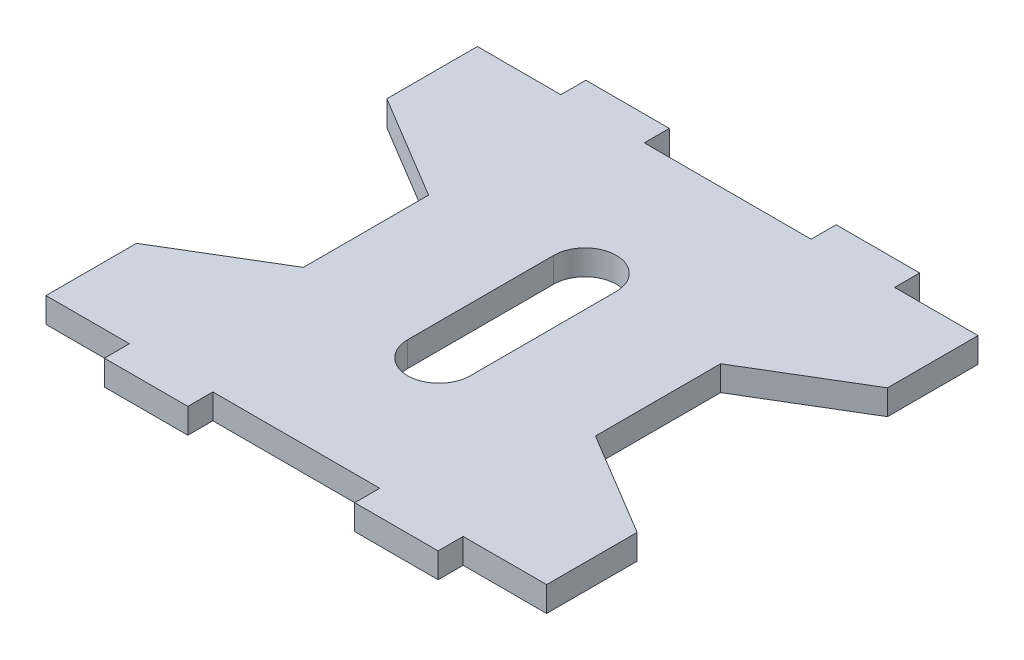
ISO-10303-21;
HEADER;
FILE_DESCRIPTION(('STEP AP214'),'2;1');
FILE_NAME('part.step','',(''),(''),'','','');
FILE_SCHEMA(('AUTOMOTIVE_DESIGN { 1 0 10303 214 1 1 1 1 }'));
ENDSEC;
DATA;
#1=APPLICATION_CONTEXT('core data for automotive mechanical design processes');
#2=APPLICATION_PROTOCOL_DEFINITION('international standard','automotive_design',2000,#1);
#3=PRODUCT_CONTEXT('',#1,'mechanical');
#4=PRODUCT('Part','Part','',(#3));
#5=PRODUCT_RELATED_PRODUCT_CATEGORY('part','',(#4));
#6=PRODUCT_DEFINITION_FORMATION('','',#4);
#7=PRODUCT_DEFINITION_CONTEXT('part definition',#1,'design');
#8=PRODUCT_DEFINITION('design','',#6,#7);
#9=PRODUCT_DEFINITION_SHAPE('','',#8);
#10=(LENGTH_UNIT() NAMED_UNIT(*) SI_UNIT(.MILLI.,.METRE.));
#11=(NAMED_UNIT(*) PLANE_ANGLE_UNIT() SI_UNIT($,.RADIAN.));
#12=(NAMED_UNIT(*) SI_UNIT($,.STERADIAN.) SOLID_ANGLE_UNIT());
#13=UNCERTAINTY_MEASURE_WITH_UNIT(LENGTH_MEASURE(1.E-05),#10,'distance_accuracy_value','');
#14=(GEOMETRIC_REPRESENTATION_CONTEXT(3) GLOBAL_UNCERTAINTY_ASSIGNED_CONTEXT((#13)) GLOBAL_UNIT_ASSIGNED_CONTEXT((#10,
#11,#12)) REPRESENTATION_CONTEXT('',''));
#15=CARTESIAN_POINT('',(0.,0.,0.));
#16=DIRECTION('',(0.,0.,1.));
#17=DIRECTION('',(1.,0.,0.));
#18=AXIS2_PLACEMENT_3D('',#15,#16,#17);
#19=CARTESIAN_POINT('',(0.,3.,0.));
#20=DIRECTION('',(0.,1.,0.));
#21=DIRECTION('',(0.,0.,1.));
#22=AXIS2_PLACEMENT_3D('',#19,#20,#21);
#23=PLANE('',#22);
#24=DIRECTION('',(0.857492925712544,0.,-0.514495755427526));
#25=VECTOR('',#24,1.);
#26=CARTESIAN_POINT('',(17.5,3.,-7.5));
#27=LINE('',#26,#25);
#28=CARTESIAN_POINT('',(17.5,3.,-7.5));
#29=VERTEX_POINT('',#28);
#30=CARTESIAN_POINT('',(30.,3.,-15.));
#31=VERTEX_POINT('',#30);
#32=EDGE_CURVE('E297',#29,#31,#27,.T.);
#33=ORIENTED_EDGE('',*,*,#32,.T.);
#34=DIRECTION('',(0.,0.,-1.));
#35=VECTOR('',#34,1.);
#36=CARTESIAN_POINT('',(30.,3.,-15.));
#37=LINE('',#36,#35);
#38=CARTESIAN_POINT('',(30.,3.,-25.85));
#39=VERTEX_POINT('',#38);
#40=EDGE_CURVE('E301',#31,#39,#37,.T.);
#41=ORIENTED_EDGE('',*,*,#40,.T.);
#42=DIRECTION('',(-1.,0.,0.));
#43=VECTOR('',#42,1.);
#44=CARTESIAN_POINT('',(30.,3.,-25.85));
#45=LINE('',#44,#43);
#46=CARTESIAN_POINT('',(20.,3.,-25.85));
#47=VERTEX_POINT('',#46);
#48=EDGE_CURVE('E305',#39,#47,#45,.T.);
#49=ORIENTED_EDGE('',*,*,#48,.T.);
#50=DIRECTION('',(0.,0.,-1.));
#51=VECTOR('',#50,1.);
#52=CARTESIAN_POINT('',(20.,3.,-25.85));
#53=LINE('',#52,#51);
#54=CARTESIAN_POINT('',(20.,3.,-28.85));
#55=VERTEX_POINT('',#54);
#56=EDGE_CURVE('E308',#47,#55,#53,.T.);
#57=ORIENTED_EDGE('',*,*,#56,.T.);
#58=DIRECTION('',(-1.,0.,0.));
#59=VECTOR('',#58,1.);
#60=CARTESIAN_POINT('',(20.,3.,-28.85));
#61=LINE('',#60,#59);
#62=CARTESIAN_POINT('',(9.99999999999999,3.,-28.85));
#63=VERTEX_POINT('',#62);
#64=EDGE_CURVE('E311',#55,#63,#61,.T.);
#65=ORIENTED_EDGE('',*,*,#64,.T.);
#66=DIRECTION('',(0.,0.,1.));
#67=VECTOR('',#66,1.);
#68=CARTESIAN_POINT('',(9.99999999999999,3.,-28.85));
#69=LINE('',#68,#67);
#70=CARTESIAN_POINT('',(9.99999999999999,3.,-25.85));
#71=VERTEX_POINT('',#70);
#72=EDGE_CURVE('E314',#63,#71,#69,.T.);
#73=ORIENTED_EDGE('',*,*,#72,.T.);
#74=DIRECTION('',(-1.,0.,0.));
#75=VECTOR('',#74,1.);
#76=CARTESIAN_POINT('',(9.99999999999999,3.,-25.85));
#77=LINE('',#76,#75);
#78=CARTESIAN_POINT('',(-9.99999999999999,3.,-25.85));
#79=VERTEX_POINT('',#78);
#80=EDGE_CURVE('E317',#71,#79,#77,.T.);
#81=ORIENTED_EDGE('',*,*,#80,.T.);
#82=DIRECTION('',(0.,0.,-1.));
#83=VECTOR('',#82,1.);
#84=CARTESIAN_POINT('',(-9.99999999999999,3.,-28.85));
#85=LINE('',#84,#83);
#86=CARTESIAN_POINT('',(-9.99999999999999,3.,-28.85));
#87=VERTEX_POINT('',#86);
#88=EDGE_CURVE('E320',#79,#87,#85,.T.);
#89=ORIENTED_EDGE('',*,*,#88,.T.);
#90=DIRECTION('',(-1.,0.,0.));
#91=VECTOR('',#90,1.);
#92=CARTESIAN_POINT('',(-20.,3.,-28.85));
#93=LINE('',#92,#91);
#94=CARTESIAN_POINT('',(-20.,3.,-28.85));
#95=VERTEX_POINT('',#94);
#96=EDGE_CURVE('E323',#87,#95,#93,.T.);
#97=ORIENTED_EDGE('',*,*,#96,.T.);
#98=DIRECTION('',(0.,0.,1.));
#99=VECTOR('',#98,1.);
#100=CARTESIAN_POINT('',(-20.,3.,-25.85));
#101=LINE('',#100,#99);
#102=CARTESIAN_POINT('',(-20.,3.,-25.85));
#103=VERTEX_POINT('',#102);
#104=EDGE_CURVE('E326',#95,#103,#101,.T.);
#105=ORIENTED_EDGE('',*,*,#104,.T.);
#106=DIRECTION('',(-1.,0.,0.));
#107=VECTOR('',#106,1.);
#108=CARTESIAN_POINT('',(-30.,3.,-25.85));
#109=LINE('',#108,#107);
#110=CARTESIAN_POINT('',(-30.,3.,-25.85));
#111=VERTEX_POINT('',#110);
#112=EDGE_CURVE('E329',#103,#111,#109,.T.);
#113=ORIENTED_EDGE('',*,*,#112,.T.);
#114=DIRECTION('',(0.,0.,1.));
#115=VECTOR('',#114,1.);
#116=CARTESIAN_POINT('',(-30.,3.,-15.));
#117=LINE('',#116,#115);
#118=CARTESIAN_POINT('',(-30.,3.,-15.));
#119=VERTEX_POINT('',#118);
#120=EDGE_CURVE('E332',#111,#119,#117,.T.);
#121=ORIENTED_EDGE('',*,*,#120,.T.);
#122=DIRECTION('',(0.857492925712544,0.,0.514495755427526));
#123=VECTOR('',#122,1.);
#124=CARTESIAN_POINT('',(-17.5,3.,-7.5));
#125=LINE('',#124,#123);
#126=CARTESIAN_POINT('',(-17.5,3.,-7.5));
#127=VERTEX_POINT('',#126);
#128=EDGE_CURVE('E335',#119,#127,#125,.T.);
#129=ORIENTED_EDGE('',*,*,#128,.T.);
#130=DIRECTION('',(0.,0.,1.));
#131=VECTOR('',#130,1.);
#132=CARTESIAN_POINT('',(-17.5,3.,7.5));
#133=LINE('',#132,#131);
#134=CARTESIAN_POINT('',(-17.5,3.,7.5));
#135=VERTEX_POINT('',#134);
#136=EDGE_CURVE('E338',#127,#135,#133,.T.);
#137=ORIENTED_EDGE('',*,*,#136,.T.);
#138=DIRECTION('',(-0.857492925712544,0.,0.514495755427526));
#139=VECTOR('',#138,1.);
#140=CARTESIAN_POINT('',(-17.5,3.,7.5));
#141=LINE('',#140,#139);
#142=CARTESIAN_POINT('',(-30.,3.,15.));
#143=VERTEX_POINT('',#142);
#144=EDGE_CURVE('E341',#135,#143,#141,.T.);
#145=ORIENTED_EDGE('',*,*,#144,.T.);
#146=DIRECTION('',(0.,0.,1.));
#147=VECTOR('',#146,1.);
#148=CARTESIAN_POINT('',(-30.,3.,15.));
#149=LINE('',#148,#147);
#150=CARTESIAN_POINT('',(-30.,3.,25.85));
#151=VERTEX_POINT('',#150);
#152=EDGE_CURVE('E344',#143,#151,#149,.T.);
#153=ORIENTED_EDGE('',*,*,#152,.T.);
#154=DIRECTION('',(1.,0.,0.));
#155=VECTOR('',#154,1.);
#156=CARTESIAN_POINT('',(-30.,3.,25.85));
#157=LINE('',#156,#155);
#158=CARTESIAN_POINT('',(-20.,3.,25.85));
#159=VERTEX_POINT('',#158);
#160=EDGE_CURVE('E347',#151,#159,#157,.T.);
#161=ORIENTED_EDGE('',*,*,#160,.T.);
#162=DIRECTION('',(0.,0.,1.));
#163=VECTOR('',#162,1.);
#164=CARTESIAN_POINT('',(-20.,3.,25.85));
#165=LINE('',#164,#163);
#166=CARTESIAN_POINT('',(-20.,3.,28.85));
#167=VERTEX_POINT('',#166);
#168=EDGE_CURVE('E350',#159,#167,#165,.T.);
#169=ORIENTED_EDGE('',*,*,#168,.T.);
#170=DIRECTION('',(1.,0.,0.));
#171=VECTOR('',#170,1.);
#172=CARTESIAN_POINT('',(-20.,3.,28.85));
#173=LINE('',#172,#171);
#174=CARTESIAN_POINT('',(-9.99999999999999,3.,28.85));
#175=VERTEX_POINT('',#174);
#176=EDGE_CURVE('E353',#167,#175,#173,.T.);
#177=ORIENTED_EDGE('',*,*,#176,.T.);
#178=DIRECTION('',(0.,0.,-1.));
#179=VECTOR('',#178,1.);
#180=CARTESIAN_POINT('',(-9.99999999999999,3.,28.85));
#181=LINE('',#180,#179);
#182=CARTESIAN_POINT('',(-9.99999999999999,3.,25.85));
#183=VERTEX_POINT('',#182);
#184=EDGE_CURVE('E356',#175,#183,#181,.T.);
#185=ORIENTED_EDGE('',*,*,#184,.T.);
#186=DIRECTION('',(1.,0.,0.));
#187=VECTOR('',#186,1.);
#188=CARTESIAN_POINT('',(9.99999999999999,3.,25.85));
#189=LINE('',#188,#187);
#190=CARTESIAN_POINT('',(9.99999999999999,3.,25.85));
#191=VERTEX_POINT('',#190);
#192=EDGE_CURVE('E359',#183,#191,#189,.T.);
#193=ORIENTED_EDGE('',*,*,#192,.T.);
#194=DIRECTION('',(0.,0.,1.));
#195=VECTOR('',#194,1.);
#196=CARTESIAN_POINT('',(9.99999999999999,3.,28.85));
#197=LINE('',#196,#195);
#198=CARTESIAN_POINT('',(9.99999999999999,3.,28.85));
#199=VERTEX_POINT('',#198);
#200=EDGE_CURVE('E362',#191,#199,#197,.T.);
#201=ORIENTED_EDGE('',*,*,#200,.T.);
#202=DIRECTION('',(1.,0.,0.));
#203=VECTOR('',#202,1.);
#204=CARTESIAN_POINT('',(20.,3.,28.85));
#205=LINE('',#204,#203);
#206=CARTESIAN_POINT('',(20.,3.,28.85));
#207=VERTEX_POINT('',#206);
#208=EDGE_CURVE('E365',#199,#207,#205,.T.);
#209=ORIENTED_EDGE('',*,*,#208,.T.);
#210=DIRECTION('',(0.,0.,-1.));
#211=VECTOR('',#210,1.);
#212=CARTESIAN_POINT('',(20.,3.,25.85));
#213=LINE('',#212,#211);
#214=CARTESIAN_POINT('',(20.,3.,25.85));
#215=VERTEX_POINT('',#214);
#216=EDGE_CURVE('E368',#207,#215,#213,.T.);
#217=ORIENTED_EDGE('',*,*,#216,.T.);
#218=DIRECTION('',(1.,0.,0.));
#219=VECTOR('',#218,1.);
#220=CARTESIAN_POINT('',(30.,3.,25.85));
#221=LINE('',#220,#219);
#222=CARTESIAN_POINT('',(30.,3.,25.85));
#223=VERTEX_POINT('',#222);
#224=EDGE_CURVE('E371',#215,#223,#221,.T.);
#225=ORIENTED_EDGE('',*,*,#224,.T.);
#226=DIRECTION('',(0.,0.,-1.));
#227=VECTOR('',#226,1.);
#228=CARTESIAN_POINT('',(30.,3.,15.));
#229=LINE('',#228,#227);
#230=CARTESIAN_POINT('',(30.,3.,15.));
#231=VERTEX_POINT('',#230);
#232=EDGE_CURVE('E374',#223,#231,#229,.T.);
#233=ORIENTED_EDGE('',*,*,#232,.T.);
#234=DIRECTION('',(-0.857492925712544,0.,-0.514495755427526));
#235=VECTOR('',#234,1.);
#236=CARTESIAN_POINT('',(17.5,3.,7.5));
#237=LINE('',#236,#235);
#238=CARTESIAN_POINT('',(17.5,3.,7.5));
#239=VERTEX_POINT('',#238);
#240=EDGE_CURVE('E377',#231,#239,#237,.T.);
#241=ORIENTED_EDGE('',*,*,#240,.T.);
#242=DIRECTION('',(0.,0.,-1.));
#243=VECTOR('',#242,1.);
#244=CARTESIAN_POINT('',(17.5,3.,7.5));
#245=LINE('',#244,#243);
#246=EDGE_CURVE('E380',#239,#29,#245,.T.);
#247=ORIENTED_EDGE('',*,*,#246,.T.);
#248=EDGE_LOOP('',(#33,#41,#49,#57,#65,#73,#81,#89,#97,#105,#113,#121,#129,#137,#145,#153,#161,
#169,#177,#185,#193,#201,#209,#217,#225,#233,#241,#247));
#249=FACE_BOUND('',#248,.T.);
#250=DIRECTION('',(0.,0.,1.));
#251=VECTOR('',#250,1.);
#252=CARTESIAN_POINT('',(-3.75,3.,-8.75));
#253=LINE('',#252,#251);
#254=CARTESIAN_POINT('',(-3.75,3.,-8.75));
#255=VERTEX_POINT('',#254);
#256=CARTESIAN_POINT('',(-3.75,3.,8.75));
#257=VERTEX_POINT('',#256);
#258=EDGE_CURVE('E258',#255,#257,#253,.T.);
#259=ORIENTED_EDGE('',*,*,#258,.F.);
#260=CARTESIAN_POINT('',(0.,3.,-8.74999999999999));
#261=DIRECTION('',(0.,1.,0.));
#262=DIRECTION('',(0.,0.,1.));
#263=AXIS2_PLACEMENT_3D('',#260,#261,#262);
#264=CIRCLE('',#263,3.75);
#265=CARTESIAN_POINT('',(3.75,3.,-8.75));
#266=VERTEX_POINT('',#265);
#267=EDGE_CURVE('E249',#266,#255,#264,.T.);
#268=ORIENTED_EDGE('',*,*,#267,.F.);
#269=DIRECTION('',(0.,0.,-1.));
#270=VECTOR('',#269,1.);
#271=CARTESIAN_POINT('',(3.75,3.,-8.75));
#272=LINE('',#271,#270);
#273=CARTESIAN_POINT('',(3.75,3.,8.75));
#274=VERTEX_POINT('',#273);
#275=EDGE_CURVE('E275',#274,#266,#272,.T.);
#276=ORIENTED_EDGE('',*,*,#275,.F.);
#277=CARTESIAN_POINT('',(0.,3.,8.74999999999999));
#278=DIRECTION('',(0.,1.,0.));
#279=DIRECTION('',(0.,0.,-1.));
#280=AXIS2_PLACEMENT_3D('',#277,#278,#279);
#281=CIRCLE('',#280,3.75);
#282=EDGE_CURVE('E271',#257,#274,#281,.T.);
#283=ORIENTED_EDGE('',*,*,#282,.F.);
#284=EDGE_LOOP('',(#259,#268,#276,#283));
#285=FACE_BOUND('',#284,.T.);
#286=ADVANCED_FACE('F39',(#249,#285),#23,.T.);
#287=CARTESIAN_POINT('',(0.,0.,0.));
#288=DIRECTION('',(0.,1.,0.));
#289=DIRECTION('',(0.,0.,1.));
#290=AXIS2_PLACEMENT_3D('',#287,#288,#289);
#291=PLANE('',#290);
#292=DIRECTION('',(0.857492925712544,0.,-0.514495755427526));
#293=VECTOR('',#292,1.);
#294=CARTESIAN_POINT('',(17.5,0.,-7.5));
#295=LINE('',#294,#293);
#296=CARTESIAN_POINT('',(17.5,0.,-7.5));
#297=VERTEX_POINT('',#296);
#298=CARTESIAN_POINT('',(30.,0.,-15.));
#299=VERTEX_POINT('',#298);
#300=EDGE_CURVE('E267',#297,#299,#295,.T.);
#301=ORIENTED_EDGE('',*,*,#300,.F.);
#302=DIRECTION('',(0.,0.,-1.));
#303=VECTOR('',#302,1.);
#304=CARTESIAN_POINT('',(17.5,0.,7.5));
#305=LINE('',#304,#303);
#306=CARTESIAN_POINT('',(17.5,0.,7.5));
#307=VERTEX_POINT('',#306);
#308=EDGE_CURVE('E302',#307,#297,#305,.T.);
#309=ORIENTED_EDGE('',*,*,#308,.F.);
#310=DIRECTION('',(-0.857492925712544,0.,-0.514495755427526));
#311=VECTOR('',#310,1.);
#312=CARTESIAN_POINT('',(17.5,0.,7.5));
#313=LINE('',#312,#311);
#314=CARTESIAN_POINT('',(30.,0.,15.));
#315=VERTEX_POINT('',#314);
#316=EDGE_CURVE('E462',#315,#307,#313,.T.);
#317=ORIENTED_EDGE('',*,*,#316,.F.);
#318=DIRECTION('',(0.,0.,-1.));
#319=VECTOR('',#318,1.);
#320=CARTESIAN_POINT('',(30.,0.,15.));
#321=LINE('',#320,#319);
#322=CARTESIAN_POINT('',(30.,0.,25.85));
#323=VERTEX_POINT('',#322);
#324=EDGE_CURVE('E459',#323,#315,#321,.T.);
#325=ORIENTED_EDGE('',*,*,#324,.F.);
#326=DIRECTION('',(1.,0.,0.));
#327=VECTOR('',#326,1.);
#328=CARTESIAN_POINT('',(30.,0.,25.85));
#329=LINE('',#328,#327);
#330=CARTESIAN_POINT('',(20.,0.,25.85));
#331=VERTEX_POINT('',#330);
#332=EDGE_CURVE('E456',#331,#323,#329,.T.);
#333=ORIENTED_EDGE('',*,*,#332,.F.);
#334=DIRECTION('',(0.,0.,-1.));
#335=VECTOR('',#334,1.);
#336=CARTESIAN_POINT('',(20.,0.,25.85));
#337=LINE('',#336,#335);
#338=CARTESIAN_POINT('',(20.,0.,28.85));
#339=VERTEX_POINT('',#338);
#340=EDGE_CURVE('E453',#339,#331,#337,.T.);
#341=ORIENTED_EDGE('',*,*,#340,.F.);
#342=DIRECTION('',(1.,0.,0.));
#343=VECTOR('',#342,1.);
#344=CARTESIAN_POINT('',(20.,0.,28.85));
#345=LINE('',#344,#343);
#346=CARTESIAN_POINT('',(9.99999999999999,0.,28.85));
#347=VERTEX_POINT('',#346);
#348=EDGE_CURVE('E450',#347,#339,#345,.T.);
#349=ORIENTED_EDGE('',*,*,#348,.F.);
#350=DIRECTION('',(0.,0.,1.));
#351=VECTOR('',#350,1.);
#352=CARTESIAN_POINT('',(9.99999999999999,0.,28.85));
#353=LINE('',#352,#351);
#354=CARTESIAN_POINT('',(9.99999999999999,0.,25.85));
#355=VERTEX_POINT('',#354);
#356=EDGE_CURVE('E447',#355,#347,#353,.T.);
#357=ORIENTED_EDGE('',*,*,#356,.F.);
#358=DIRECTION('',(1.,0.,0.));
#359=VECTOR('',#358,1.);
#360=CARTESIAN_POINT('',(9.99999999999999,0.,25.85));
#361=LINE('',#360,#359);
#362=CARTESIAN_POINT('',(-9.99999999999999,0.,25.85));
#363=VERTEX_POINT('',#362);
#364=EDGE_CURVE('E444',#363,#355,#361,.T.);
#365=ORIENTED_EDGE('',*,*,#364,.F.);
#366=DIRECTION('',(0.,0.,-1.));
#367=VECTOR('',#366,1.);
#368=CARTESIAN_POINT('',(-9.99999999999999,0.,28.85));
#369=LINE('',#368,#367);
#370=CARTESIAN_POINT('',(-9.99999999999999,0.,28.85));
#371=VERTEX_POINT('',#370);
#372=EDGE_CURVE('E441',#371,#363,#369,.T.);
#373=ORIENTED_EDGE('',*,*,#372,.F.);
#374=DIRECTION('',(1.,0.,0.));
#375=VECTOR('',#374,1.);
#376=CARTESIAN_POINT('',(-20.,0.,28.85));
#377=LINE('',#376,#375);
#378=CARTESIAN_POINT('',(-20.,0.,28.85));
#379=VERTEX_POINT('',#378);
#380=EDGE_CURVE('E438',#379,#371,#377,.T.);
#381=ORIENTED_EDGE('',*,*,#380,.F.);
#382=DIRECTION('',(0.,0.,1.));
#383=VECTOR('',#382,1.);
#384=CARTESIAN_POINT('',(-20.,0.,25.85));
#385=LINE('',#384,#383);
#386=CARTESIAN_POINT('',(-20.,0.,25.85));
#387=VERTEX_POINT('',#386);
#388=EDGE_CURVE('E435',#387,#379,#385,.T.);
#389=ORIENTED_EDGE('',*,*,#388,.F.);
#390=DIRECTION('',(1.,0.,0.));
#391=VECTOR('',#390,1.);
#392=CARTESIAN_POINT('',(-30.,0.,25.85));
#393=LINE('',#392,#391);
#394=CARTESIAN_POINT('',(-30.,0.,25.85));
#395=VERTEX_POINT('',#394);
#396=EDGE_CURVE('E432',#395,#387,#393,.T.);
#397=ORIENTED_EDGE('',*,*,#396,.F.);
#398=DIRECTION('',(0.,0.,1.));
#399=VECTOR('',#398,1.);
#400=CARTESIAN_POINT('',(-30.,0.,15.));
#401=LINE('',#400,#399);
#402=CARTESIAN_POINT('',(-30.,0.,15.));
#403=VERTEX_POINT('',#402);
#404=EDGE_CURVE('E429',#403,#395,#401,.T.);
#405=ORIENTED_EDGE('',*,*,#404,.F.);
#406=DIRECTION('',(-0.857492925712544,0.,0.514495755427526));
#407=VECTOR('',#406,1.);
#408=CARTESIAN_POINT('',(-17.5,0.,7.5));
#409=LINE('',#408,#407);
#410=CARTESIAN_POINT('',(-17.5,0.,7.5));
#411=VERTEX_POINT('',#410);
#412=EDGE_CURVE('E426',#411,#403,#409,.T.);
#413=ORIENTED_EDGE('',*,*,#412,.F.);
#414=DIRECTION('',(0.,0.,1.));
#415=VECTOR('',#414,1.);
#416=CARTESIAN_POINT('',(-17.5,0.,7.5));
#417=LINE('',#416,#415);
#418=CARTESIAN_POINT('',(-17.5,0.,-7.5));
#419=VERTEX_POINT('',#418);
#420=EDGE_CURVE('E423',#419,#411,#417,.T.);
#421=ORIENTED_EDGE('',*,*,#420,.F.);
#422=DIRECTION('',(0.857492925712544,0.,0.514495755427526));
#423=VECTOR('',#422,1.);
#424=CARTESIAN_POINT('',(-17.5,0.,-7.5));
#425=LINE('',#424,#423);
#426=CARTESIAN_POINT('',(-30.,0.,-15.));
#427=VERTEX_POINT('',#426);
#428=EDGE_CURVE('E420',#427,#419,#425,.T.);
#429=ORIENTED_EDGE('',*,*,#428,.F.);
#430=DIRECTION('',(0.,0.,1.));
#431=VECTOR('',#430,1.);
#432=CARTESIAN_POINT('',(-30.,0.,-15.));
#433=LINE('',#432,#431);
#434=CARTESIAN_POINT('',(-30.,0.,-25.85));
#435=VERTEX_POINT('',#434);
#436=EDGE_CURVE('E417',#435,#427,#433,.T.);
#437=ORIENTED_EDGE('',*,*,#436,.F.);
#438=DIRECTION('',(-1.,0.,0.));
#439=VECTOR('',#438,1.);
#440=CARTESIAN_POINT('',(-30.,0.,-25.85));
#441=LINE('',#440,#439);
#442=CARTESIAN_POINT('',(-20.,0.,-25.85));
#443=VERTEX_POINT('',#442);
#444=EDGE_CURVE('E414',#443,#435,#441,.T.);
#445=ORIENTED_EDGE('',*,*,#444,.F.);
#446=DIRECTION('',(0.,0.,1.));
#447=VECTOR('',#446,1.);
#448=CARTESIAN_POINT('',(-20.,0.,-25.85));
#449=LINE('',#448,#447);
#450=CARTESIAN_POINT('',(-20.,0.,-28.85));
#451=VERTEX_POINT('',#450);
#452=EDGE_CURVE('E411',#451,#443,#449,.T.);
#453=ORIENTED_EDGE('',*,*,#452,.F.);
#454=DIRECTION('',(-1.,0.,0.));
#455=VECTOR('',#454,1.);
#456=CARTESIAN_POINT('',(-20.,0.,-28.85));
#457=LINE('',#456,#455);
#458=CARTESIAN_POINT('',(-9.99999999999999,0.,-28.85));
#459=VERTEX_POINT('',#458);
#460=EDGE_CURVE('E408',#459,#451,#457,.T.);
#461=ORIENTED_EDGE('',*,*,#460,.F.);
#462=DIRECTION('',(0.,0.,-1.));
#463=VECTOR('',#462,1.);
#464=CARTESIAN_POINT('',(-9.99999999999999,0.,-28.85));
#465=LINE('',#464,#463);
#466=CARTESIAN_POINT('',(-9.99999999999999,0.,-25.85));
#467=VERTEX_POINT('',#466);
#468=EDGE_CURVE('E405',#467,#459,#465,.T.);
#469=ORIENTED_EDGE('',*,*,#468,.F.);
#470=DIRECTION('',(-1.,0.,0.));
#471=VECTOR('',#470,1.);
#472=CARTESIAN_POINT('',(9.99999999999999,0.,-25.85));
#473=LINE('',#472,#471);
#474=CARTESIAN_POINT('',(9.99999999999999,0.,-25.85));
#475=VERTEX_POINT('',#474);
#476=EDGE_CURVE('E402',#475,#467,#473,.T.);
#477=ORIENTED_EDGE('',*,*,#476,.F.);
#478=DIRECTION('',(0.,0.,1.));
#479=VECTOR('',#478,1.);
#480=CARTESIAN_POINT('',(9.99999999999999,0.,-28.85));
#481=LINE('',#480,#479);
#482=CARTESIAN_POINT('',(9.99999999999999,0.,-28.85));
#483=VERTEX_POINT('',#482);
#484=EDGE_CURVE('E399',#483,#475,#481,.T.);
#485=ORIENTED_EDGE('',*,*,#484,.F.);
#486=DIRECTION('',(-1.,0.,0.));
#487=VECTOR('',#486,1.);
#488=CARTESIAN_POINT('',(20.,0.,-28.85));
#489=LINE('',#488,#487);
#490=CARTESIAN_POINT('',(20.,0.,-28.85));
#491=VERTEX_POINT('',#490);
#492=EDGE_CURVE('E396',#491,#483,#489,.T.);
#493=ORIENTED_EDGE('',*,*,#492,.F.);
#494=DIRECTION('',(0.,0.,-1.));
#495=VECTOR('',#494,1.);
#496=CARTESIAN_POINT('',(20.,0.,-25.85));
#497=LINE('',#496,#495);
#498=CARTESIAN_POINT('',(20.,0.,-25.85));
#499=VERTEX_POINT('',#498);
#500=EDGE_CURVE('E393',#499,#491,#497,.T.);
#501=ORIENTED_EDGE('',*,*,#500,.F.);
#502=DIRECTION('',(-1.,0.,0.));
#503=VECTOR('',#502,1.);
#504=CARTESIAN_POINT('',(30.,0.,-25.85));
#505=LINE('',#504,#503);
#506=CARTESIAN_POINT('',(30.,0.,-25.85));
#507=VERTEX_POINT('',#506);
#508=EDGE_CURVE('E390',#507,#499,#505,.T.);
#509=ORIENTED_EDGE('',*,*,#508,.F.);
#510=DIRECTION('',(0.,0.,-1.));
#511=VECTOR('',#510,1.);
#512=CARTESIAN_POINT('',(30.,0.,-15.));
#513=LINE('',#512,#511);
#514=EDGE_CURVE('E387',#299,#507,#513,.T.);
#515=ORIENTED_EDGE('',*,*,#514,.F.);
#516=EDGE_LOOP('',(#301,#309,#317,#325,#333,#341,#349,#357,#365,#373,#381,#389,#397,#405,#413,
#421,#429,#437,#445,#453,#461,#469,#477,#485,#493,#501,#509,#515));
#517=FACE_BOUND('',#516,.T.);
#518=CARTESIAN_POINT('',(0.,0.,-8.74999999999999));
#519=DIRECTION('',(0.,1.,0.));
#520=DIRECTION('',(0.,0.,1.));
#521=AXIS2_PLACEMENT_3D('',#518,#519,#520);
#522=CIRCLE('',#521,3.75);
#523=CARTESIAN_POINT('',(3.75,0.,-8.75));
#524=VERTEX_POINT('',#523);
#525=CARTESIAN_POINT('',(-3.75,0.,-8.75));
#526=VERTEX_POINT('',#525);
#527=EDGE_CURVE('E63',#524,#526,#522,.T.);
#528=ORIENTED_EDGE('',*,*,#527,.T.);
#529=DIRECTION('',(0.,0.,1.));
#530=VECTOR('',#529,1.);
#531=CARTESIAN_POINT('',(-3.75,0.,-8.75));
#532=LINE('',#531,#530);
#533=CARTESIAN_POINT('',(-3.75,0.,8.75));
#534=VERTEX_POINT('',#533);
#535=EDGE_CURVE('E265',#526,#534,#532,.T.);
#536=ORIENTED_EDGE('',*,*,#535,.T.);
#537=CARTESIAN_POINT('',(0.,0.,8.74999999999999));
#538=DIRECTION('',(0.,1.,0.));
#539=DIRECTION('',(0.,0.,-1.));
#540=AXIS2_PLACEMENT_3D('',#537,#538,#539);
#541=CIRCLE('',#540,3.75);
#542=CARTESIAN_POINT('',(3.75,0.,8.75));
#543=VERTEX_POINT('',#542);
#544=EDGE_CURVE('E284',#534,#543,#541,.T.);
#545=ORIENTED_EDGE('',*,*,#544,.T.);
#546=DIRECTION('',(0.,0.,-1.));
#547=VECTOR('',#546,1.);
#548=CARTESIAN_POINT('',(3.75,0.,-8.75));
#549=LINE('',#548,#547);
#550=EDGE_CURVE('E259',#543,#524,#549,.T.);
#551=ORIENTED_EDGE('',*,*,#550,.T.);
#552=EDGE_LOOP('',(#528,#536,#545,#551));
#553=FACE_BOUND('',#552,.T.);
#554=ADVANCED_FACE('F581',(#517,#553),#291,.F.);
#555=CARTESIAN_POINT('',(17.5,3.,-7.5));
#556=DIRECTION('',(-0.514495755427526,0.,-0.857492925712544));
#557=DIRECTION('',(-0.857492925712544,0.,0.514495755427526));
#558=AXIS2_PLACEMENT_3D('',#555,#556,#557);
#559=PLANE('',#558);
#560=ORIENTED_EDGE('',*,*,#300,.T.);
#561=DIRECTION('',(0.,-1.,0.));
#562=VECTOR('',#561,1.);
#563=CARTESIAN_POINT('',(30.,3.,-15.));
#564=LINE('',#563,#562);
#565=EDGE_CURVE('E11',#31,#299,#564,.T.);
#566=ORIENTED_EDGE('',*,*,#565,.F.);
#567=ORIENTED_EDGE('',*,*,#32,.F.);
#568=DIRECTION('',(0.,-1.,0.));
#569=VECTOR('',#568,1.);
#570=CARTESIAN_POINT('',(17.5,3.,-7.5));
#571=LINE('',#570,#569);
#572=EDGE_CURVE('E383',#29,#297,#571,.T.);
#573=ORIENTED_EDGE('',*,*,#572,.T.);
#574=EDGE_LOOP('',(#560,#566,#567,#573));
#575=FACE_BOUND('',#574,.T.);
#576=ADVANCED_FACE('F41',(#575),#559,.F.);
#577=CARTESIAN_POINT('',(30.,3.,-15.));
#578=DIRECTION('',(-1.,0.,0.));
#579=DIRECTION('',(0.,0.,1.));
#580=AXIS2_PLACEMENT_3D('',#577,#578,#579);
#581=PLANE('',#580);
#582=ORIENTED_EDGE('',*,*,#514,.T.);
#583=DIRECTION('',(0.,-1.,0.));
#584=VECTOR('',#583,1.);
#585=CARTESIAN_POINT('',(30.,3.,-25.85));
#586=LINE('',#585,#584);
#587=EDGE_CURVE('E48',#39,#507,#586,.T.);
#588=ORIENTED_EDGE('',*,*,#587,.F.);
#589=ORIENTED_EDGE('',*,*,#40,.F.);
#590=ORIENTED_EDGE('',*,*,#565,.T.);
#591=EDGE_LOOP('',(#582,#588,#589,#590));
#592=FACE_BOUND('',#591,.T.);
#593=ADVANCED_FACE('F598',(#592),#581,.F.);
#594=CARTESIAN_POINT('',(30.,3.,-25.85));
#595=DIRECTION('',(0.,0.,1.));
#596=DIRECTION('',(1.,0.,0.));
#597=AXIS2_PLACEMENT_3D('',#594,#595,#596);
#598=PLANE('',#597);
#599=ORIENTED_EDGE('',*,*,#508,.T.);
#600=DIRECTION('',(0.,-1.,0.));
#601=VECTOR('',#600,1.);
#602=CARTESIAN_POINT('',(20.,3.,-25.85));
#603=LINE('',#602,#601);
#604=EDGE_CURVE('E566',#47,#499,#603,.T.);
#605=ORIENTED_EDGE('',*,*,#604,.F.);
#606=ORIENTED_EDGE('',*,*,#48,.F.);
#607=ORIENTED_EDGE('',*,*,#587,.T.);
#608=EDGE_LOOP('',(#599,#605,#606,#607));
#609=FACE_BOUND('',#608,.T.);
#610=ADVANCED_FACE('F575',(#609),#598,.F.);
#611=CARTESIAN_POINT('',(20.,3.,-25.85));
#612=DIRECTION('',(-1.,0.,0.));
#613=DIRECTION('',(0.,0.,1.));
#614=AXIS2_PLACEMENT_3D('',#611,#612,#613);
#615=PLANE('',#614);
#616=ORIENTED_EDGE('',*,*,#500,.T.);
#617=DIRECTION('',(0.,-1.,0.));
#618=VECTOR('',#617,1.);
#619=CARTESIAN_POINT('',(20.,3.,-28.85));
#620=LINE('',#619,#618);
#621=EDGE_CURVE('E562',#55,#491,#620,.T.);
#622=ORIENTED_EDGE('',*,*,#621,.F.);
#623=ORIENTED_EDGE('',*,*,#56,.F.);
#624=ORIENTED_EDGE('',*,*,#604,.T.);
#625=EDGE_LOOP('',(#616,#622,#623,#624));
#626=FACE_BOUND('',#625,.T.);
#627=ADVANCED_FACE('F587',(#626),#615,.F.);
#628=CARTESIAN_POINT('',(20.,3.,-28.85));
#629=DIRECTION('',(0.,0.,1.));
#630=DIRECTION('',(1.,0.,0.));
#631=AXIS2_PLACEMENT_3D('',#628,#629,#630);
#632=PLANE('',#631);
#633=ORIENTED_EDGE('',*,*,#492,.T.);
#634=DIRECTION('',(0.,-1.,0.));
#635=VECTOR('',#634,1.);
#636=CARTESIAN_POINT('',(9.99999999999999,3.,-28.85));
#637=LINE('',#636,#635);
#638=EDGE_CURVE('E558',#63,#483,#637,.T.);
#639=ORIENTED_EDGE('',*,*,#638,.F.);
#640=ORIENTED_EDGE('',*,*,#64,.F.);
#641=ORIENTED_EDGE('',*,*,#621,.T.);
#642=EDGE_LOOP('',(#633,#639,#640,#641));
#643=FACE_BOUND('',#642,.T.);
#644=ADVANCED_FACE('F591',(#643),#632,.F.);
#645=CARTESIAN_POINT('',(9.99999999999999,3.,-28.85));
#646=DIRECTION('',(1.,0.,0.));
#647=DIRECTION('',(0.,0.,-1.));
#648=AXIS2_PLACEMENT_3D('',#645,#646,#647);
#649=PLANE('',#648);
#650=ORIENTED_EDGE('',*,*,#484,.T.);
#651=DIRECTION('',(0.,-1.,0.));
#652=VECTOR('',#651,1.);
#653=CARTESIAN_POINT('',(9.99999999999999,3.,-25.85));
#654=LINE('',#653,#652);
#655=EDGE_CURVE('E554',#71,#475,#654,.T.);
#656=ORIENTED_EDGE('',*,*,#655,.F.);
#657=ORIENTED_EDGE('',*,*,#72,.F.);
#658=ORIENTED_EDGE('',*,*,#638,.T.);
#659=EDGE_LOOP('',(#650,#656,#657,#658));
#660=FACE_BOUND('',#659,.T.);
#661=ADVANCED_FACE('F711',(#660),#649,.F.);
#662=CARTESIAN_POINT('',(9.99999999999999,3.,-25.85));
#663=DIRECTION('',(0.,0.,1.));
#664=DIRECTION('',(1.,0.,0.));
#665=AXIS2_PLACEMENT_3D('',#662,#663,#664);
#666=PLANE('',#665);
#667=ORIENTED_EDGE('',*,*,#476,.T.);
#668=DIRECTION('',(0.,-1.,0.));
#669=VECTOR('',#668,1.);
#670=CARTESIAN_POINT('',(-9.99999999999999,3.,-25.85));
#671=LINE('',#670,#669);
#672=EDGE_CURVE('E550',#79,#467,#671,.T.);
#673=ORIENTED_EDGE('',*,*,#672,.F.);
#674=ORIENTED_EDGE('',*,*,#80,.F.);
#675=ORIENTED_EDGE('',*,*,#655,.T.);
#676=EDGE_LOOP('',(#667,#673,#674,#675));
#677=FACE_BOUND('',#676,.T.);
#678=ADVANCED_FACE('F708',(#677),#666,.F.);
#679=CARTESIAN_POINT('',(-9.99999999999999,3.,-28.85));
#680=DIRECTION('',(-1.,0.,0.));
#681=DIRECTION('',(0.,0.,1.));
#682=AXIS2_PLACEMENT_3D('',#679,#680,#681);
#683=PLANE('',#682);
#684=ORIENTED_EDGE('',*,*,#468,.T.);
#685=DIRECTION('',(0.,-1.,0.));
#686=VECTOR('',#685,1.);
#687=CARTESIAN_POINT('',(-9.99999999999999,3.,-28.85));
#688=LINE('',#687,#686);
#689=EDGE_CURVE('E546',#87,#459,#688,.T.);
#690=ORIENTED_EDGE('',*,*,#689,.F.);
#691=ORIENTED_EDGE('',*,*,#88,.F.);
#692=ORIENTED_EDGE('',*,*,#672,.T.);
#693=EDGE_LOOP('',(#684,#690,#691,#692));
#694=FACE_BOUND('',#693,.T.);
#695=ADVANCED_FACE('F704',(#694),#683,.F.);
#696=CARTESIAN_POINT('',(-20.,3.,-28.85));
#697=DIRECTION('',(0.,0.,1.));
#698=DIRECTION('',(1.,0.,0.));
#699=AXIS2_PLACEMENT_3D('',#696,#697,#698);
#700=PLANE('',#699);
#701=ORIENTED_EDGE('',*,*,#460,.T.);
#702=DIRECTION('',(0.,-1.,0.));
#703=VECTOR('',#702,1.);
#704=CARTESIAN_POINT('',(-20.,3.,-28.85));
#705=LINE('',#704,#703);
#706=EDGE_CURVE('E542',#95,#451,#705,.T.);
#707=ORIENTED_EDGE('',*,*,#706,.F.);
#708=ORIENTED_EDGE('',*,*,#96,.F.);
#709=ORIENTED_EDGE('',*,*,#689,.T.);
#710=EDGE_LOOP('',(#701,#707,#708,#709));
#711=FACE_BOUND('',#710,.T.);
#712=ADVANCED_FACE('F700',(#711),#700,.F.);
#713=CARTESIAN_POINT('',(-20.,3.,-25.85));
#714=DIRECTION('',(1.,0.,0.));
#715=DIRECTION('',(0.,0.,-1.));
#716=AXIS2_PLACEMENT_3D('',#713,#714,#715);
#717=PLANE('',#716);
#718=ORIENTED_EDGE('',*,*,#452,.T.);
#719=DIRECTION('',(0.,-1.,0.));
#720=VECTOR('',#719,1.);
#721=CARTESIAN_POINT('',(-20.,3.,-25.85));
#722=LINE('',#721,#720);
#723=EDGE_CURVE('E538',#103,#443,#722,.T.);
#724=ORIENTED_EDGE('',*,*,#723,.F.);
#725=ORIENTED_EDGE('',*,*,#104,.F.);
#726=ORIENTED_EDGE('',*,*,#706,.T.);
#727=EDGE_LOOP('',(#718,#724,#725,#726));
#728=FACE_BOUND('',#727,.T.);
#729=ADVANCED_FACE('F695',(#728),#717,.F.);
#730=CARTESIAN_POINT('',(-30.,3.,-25.85));
#731=DIRECTION('',(0.,0.,1.));
#732=DIRECTION('',(1.,0.,0.));
#733=AXIS2_PLACEMENT_3D('',#730,#731,#732);
#734=PLANE('',#733);
#735=ORIENTED_EDGE('',*,*,#444,.T.);
#736=DIRECTION('',(0.,-1.,0.));
#737=VECTOR('',#736,1.);
#738=CARTESIAN_POINT('',(-30.,3.,-25.85));
#739=LINE('',#738,#737);
#740=EDGE_CURVE('E534',#111,#435,#739,.T.);
#741=ORIENTED_EDGE('',*,*,#740,.F.);
#742=ORIENTED_EDGE('',*,*,#112,.F.);
#743=ORIENTED_EDGE('',*,*,#723,.T.);
#744=EDGE_LOOP('',(#735,#741,#742,#743));
#745=FACE_BOUND('',#744,.T.);
#746=ADVANCED_FACE('F689',(#745),#734,.F.);
#747=CARTESIAN_POINT('',(-30.,3.,-15.));
#748=DIRECTION('',(1.,0.,0.));
#749=DIRECTION('',(0.,0.,-1.));
#750=AXIS2_PLACEMENT_3D('',#747,#748,#749);
#751=PLANE('',#750);
#752=ORIENTED_EDGE('',*,*,#436,.T.);
#753=DIRECTION('',(0.,-1.,0.));
#754=VECTOR('',#753,1.);
#755=CARTESIAN_POINT('',(-30.,3.,-15.));
#756=LINE('',#755,#754);
#757=EDGE_CURVE('E530',#119,#427,#756,.T.);
#758=ORIENTED_EDGE('',*,*,#757,.F.);
#759=ORIENTED_EDGE('',*,*,#120,.F.);
#760=ORIENTED_EDGE('',*,*,#740,.T.);
#761=EDGE_LOOP('',(#752,#758,#759,#760));
#762=FACE_BOUND('',#761,.T.);
#763=ADVANCED_FACE('F685',(#762),#751,.F.);
#764=CARTESIAN_POINT('',(-17.5,3.,-7.5));
#765=DIRECTION('',(0.514495755427526,0.,-0.857492925712544));
#766=DIRECTION('',(-0.857492925712544,0.,-0.514495755427526));
#767=AXIS2_PLACEMENT_3D('',#764,#765,#766);
#768=PLANE('',#767);
#769=ORIENTED_EDGE('',*,*,#428,.T.);
#770=DIRECTION('',(0.,-1.,0.));
#771=VECTOR('',#770,1.);
#772=CARTESIAN_POINT('',(-17.5,3.,-7.5));
#773=LINE('',#772,#771);
#774=EDGE_CURVE('E526',#127,#419,#773,.T.);
#775=ORIENTED_EDGE('',*,*,#774,.F.);
#776=ORIENTED_EDGE('',*,*,#128,.F.);
#777=ORIENTED_EDGE('',*,*,#757,.T.);
#778=EDGE_LOOP('',(#769,#775,#776,#777));
#779=FACE_BOUND('',#778,.T.);
#780=ADVANCED_FACE('F680',(#779),#768,.F.);
#781=CARTESIAN_POINT('',(-17.5,3.,7.5));
#782=DIRECTION('',(1.,0.,0.));
#783=DIRECTION('',(0.,0.,-1.));
#784=AXIS2_PLACEMENT_3D('',#781,#782,#783);
#785=PLANE('',#784);
#786=ORIENTED_EDGE('',*,*,#420,.T.);
#787=DIRECTION('',(0.,-1.,0.));
#788=VECTOR('',#787,1.);
#789=CARTESIAN_POINT('',(-17.5,3.,7.5));
#790=LINE('',#789,#788);
#791=EDGE_CURVE('E522',#135,#411,#790,.T.);
#792=ORIENTED_EDGE('',*,*,#791,.F.);
#793=ORIENTED_EDGE('',*,*,#136,.F.);
#794=ORIENTED_EDGE('',*,*,#774,.T.);
#795=EDGE_LOOP('',(#786,#792,#793,#794));
#796=FACE_BOUND('',#795,.T.);
#797=ADVANCED_FACE('F674',(#796),#785,.F.);
#798=CARTESIAN_POINT('',(-17.5,3.,7.5));
#799=DIRECTION('',(0.514495755427526,0.,0.857492925712544));
#800=DIRECTION('',(0.857492925712544,0.,-0.514495755427526));
#801=AXIS2_PLACEMENT_3D('',#798,#799,#800);
#802=PLANE('',#801);
#803=ORIENTED_EDGE('',*,*,#412,.T.);
#804=DIRECTION('',(0.,-1.,0.));
#805=VECTOR('',#804,1.);
#806=CARTESIAN_POINT('',(-30.,3.,15.));
#807=LINE('',#806,#805);
#808=EDGE_CURVE('E518',#143,#403,#807,.T.);
#809=ORIENTED_EDGE('',*,*,#808,.F.);
#810=ORIENTED_EDGE('',*,*,#144,.F.);
#811=ORIENTED_EDGE('',*,*,#791,.T.);
#812=EDGE_LOOP('',(#803,#809,#810,#811));
#813=FACE_BOUND('',#812,.T.);
#814=ADVANCED_FACE('F670',(#813),#802,.F.);
#815=CARTESIAN_POINT('',(-30.,3.,15.));
#816=DIRECTION('',(1.,0.,0.));
#817=DIRECTION('',(0.,0.,-1.));
#818=AXIS2_PLACEMENT_3D('',#815,#816,#817);
#819=PLANE('',#818);
#820=ORIENTED_EDGE('',*,*,#404,.T.);
#821=DIRECTION('',(0.,-1.,0.));
#822=VECTOR('',#821,1.);
#823=CARTESIAN_POINT('',(-30.,3.,25.85));
#824=LINE('',#823,#822);
#825=EDGE_CURVE('E514',#151,#395,#824,.T.);
#826=ORIENTED_EDGE('',*,*,#825,.F.);
#827=ORIENTED_EDGE('',*,*,#152,.F.);
#828=ORIENTED_EDGE('',*,*,#808,.T.);
#829=EDGE_LOOP('',(#820,#826,#827,#828));
#830=FACE_BOUND('',#829,.T.);
#831=ADVANCED_FACE('F665',(#830),#819,.F.);
#832=CARTESIAN_POINT('',(-30.,3.,25.85));
#833=DIRECTION('',(0.,0.,-1.));
#834=DIRECTION('',(-1.,0.,0.));
#835=AXIS2_PLACEMENT_3D('',#832,#833,#834);
#836=PLANE('',#835);
#837=ORIENTED_EDGE('',*,*,#396,.T.);
#838=DIRECTION('',(0.,-1.,0.));
#839=VECTOR('',#838,1.);
#840=CARTESIAN_POINT('',(-20.,3.,25.85));
#841=LINE('',#840,#839);
#842=EDGE_CURVE('E510',#159,#387,#841,.T.);
#843=ORIENTED_EDGE('',*,*,#842,.F.);
#844=ORIENTED_EDGE('',*,*,#160,.F.);
#845=ORIENTED_EDGE('',*,*,#825,.T.);
#846=EDGE_LOOP('',(#837,#843,#844,#845));
#847=FACE_BOUND('',#846,.T.);
#848=ADVANCED_FACE('F659',(#847),#836,.F.);
#849=CARTESIAN_POINT('',(-20.,3.,25.85));
#850=DIRECTION('',(1.,0.,0.));
#851=DIRECTION('',(0.,0.,-1.));
#852=AXIS2_PLACEMENT_3D('',#849,#850,#851);
#853=PLANE('',#852);
#854=ORIENTED_EDGE('',*,*,#388,.T.);
#855=DIRECTION('',(0.,-1.,0.));
#856=VECTOR('',#855,1.);
#857=CARTESIAN_POINT('',(-20.,3.,28.85));
#858=LINE('',#857,#856);
#859=EDGE_CURVE('E506',#167,#379,#858,.T.);
#860=ORIENTED_EDGE('',*,*,#859,.F.);
#861=ORIENTED_EDGE('',*,*,#168,.F.);
#862=ORIENTED_EDGE('',*,*,#842,.T.);
#863=EDGE_LOOP('',(#854,#860,#861,#862));
#864=FACE_BOUND('',#863,.T.);
#865=ADVANCED_FACE('F655',(#864),#853,.F.);
#866=CARTESIAN_POINT('',(-20.,3.,28.85));
#867=DIRECTION('',(0.,0.,-1.));
#868=DIRECTION('',(-1.,0.,0.));
#869=AXIS2_PLACEMENT_3D('',#866,#867,#868);
#870=PLANE('',#869);
#871=ORIENTED_EDGE('',*,*,#380,.T.);
#872=DIRECTION('',(0.,-1.,0.));
#873=VECTOR('',#872,1.);
#874=CARTESIAN_POINT('',(-9.99999999999999,3.,28.85));
#875=LINE('',#874,#873);
#876=EDGE_CURVE('E502',#175,#371,#875,.T.);
#877=ORIENTED_EDGE('',*,*,#876,.F.);
#878=ORIENTED_EDGE('',*,*,#176,.F.);
#879=ORIENTED_EDGE('',*,*,#859,.T.);
#880=EDGE_LOOP('',(#871,#877,#878,#879));
#881=FACE_BOUND('',#880,.T.);
#882=ADVANCED_FACE('F650',(#881),#870,.F.);
#883=CARTESIAN_POINT('',(-9.99999999999999,3.,28.85));
#884=DIRECTION('',(-1.,0.,0.));
#885=DIRECTION('',(0.,0.,1.));
#886=AXIS2_PLACEMENT_3D('',#883,#884,#885);
#887=PLANE('',#886);
#888=ORIENTED_EDGE('',*,*,#372,.T.);
#889=DIRECTION('',(0.,-1.,0.));
#890=VECTOR('',#889,1.);
#891=CARTESIAN_POINT('',(-9.99999999999999,3.,25.85));
#892=LINE('',#891,#890);
#893=EDGE_CURVE('E498',#183,#363,#892,.T.);
#894=ORIENTED_EDGE('',*,*,#893,.F.);
#895=ORIENTED_EDGE('',*,*,#184,.F.);
#896=ORIENTED_EDGE('',*,*,#876,.T.);
#897=EDGE_LOOP('',(#888,#894,#895,#896));
#898=FACE_BOUND('',#897,.T.);
#899=ADVANCED_FACE('F644',(#898),#887,.F.);
#900=CARTESIAN_POINT('',(9.99999999999999,3.,25.85));
#901=DIRECTION('',(0.,0.,-1.));
#902=DIRECTION('',(-1.,0.,0.));
#903=AXIS2_PLACEMENT_3D('',#900,#901,#902);
#904=PLANE('',#903);
#905=ORIENTED_EDGE('',*,*,#364,.T.);
#906=DIRECTION('',(0.,-1.,0.));
#907=VECTOR('',#906,1.);
#908=CARTESIAN_POINT('',(9.99999999999999,3.,25.85));
#909=LINE('',#908,#907);
#910=EDGE_CURVE('E494',#191,#355,#909,.T.);
#911=ORIENTED_EDGE('',*,*,#910,.F.);
#912=ORIENTED_EDGE('',*,*,#192,.F.);
#913=ORIENTED_EDGE('',*,*,#893,.T.);
#914=EDGE_LOOP('',(#905,#911,#912,#913));
#915=FACE_BOUND('',#914,.T.);
#916=ADVANCED_FACE('F640',(#915),#904,.F.);
#917=CARTESIAN_POINT('',(9.99999999999999,3.,28.85));
#918=DIRECTION('',(1.,0.,0.));
#919=DIRECTION('',(0.,0.,-1.));
#920=AXIS2_PLACEMENT_3D('',#917,#918,#919);
#921=PLANE('',#920);
#922=ORIENTED_EDGE('',*,*,#356,.T.);
#923=DIRECTION('',(0.,-1.,0.));
#924=VECTOR('',#923,1.);
#925=CARTESIAN_POINT('',(9.99999999999999,3.,28.85));
#926=LINE('',#925,#924);
#927=EDGE_CURVE('E490',#199,#347,#926,.T.);
#928=ORIENTED_EDGE('',*,*,#927,.F.);
#929=ORIENTED_EDGE('',*,*,#200,.F.);
#930=ORIENTED_EDGE('',*,*,#910,.T.);
#931=EDGE_LOOP('',(#922,#928,#929,#930));
#932=FACE_BOUND('',#931,.T.);
#933=ADVANCED_FACE('F635',(#932),#921,.F.);
#934=CARTESIAN_POINT('',(20.,3.,28.85));
#935=DIRECTION('',(0.,0.,-1.));
#936=DIRECTION('',(-1.,0.,0.));
#937=AXIS2_PLACEMENT_3D('',#934,#935,#936);
#938=PLANE('',#937);
#939=ORIENTED_EDGE('',*,*,#348,.T.);
#940=DIRECTION('',(0.,-1.,0.));
#941=VECTOR('',#940,1.);
#942=CARTESIAN_POINT('',(20.,3.,28.85));
#943=LINE('',#942,#941);
#944=EDGE_CURVE('E486',#207,#339,#943,.T.);
#945=ORIENTED_EDGE('',*,*,#944,.F.);
#946=ORIENTED_EDGE('',*,*,#208,.F.);
#947=ORIENTED_EDGE('',*,*,#927,.T.);
#948=EDGE_LOOP('',(#939,#945,#946,#947));
#949=FACE_BOUND('',#948,.T.);
#950=ADVANCED_FACE('F629',(#949),#938,.F.);
#951=CARTESIAN_POINT('',(20.,3.,25.85));
#952=DIRECTION('',(-1.,0.,0.));
#953=DIRECTION('',(0.,0.,1.));
#954=AXIS2_PLACEMENT_3D('',#951,#952,#953);
#955=PLANE('',#954);
#956=ORIENTED_EDGE('',*,*,#340,.T.);
#957=DIRECTION('',(0.,-1.,0.));
#958=VECTOR('',#957,1.);
#959=CARTESIAN_POINT('',(20.,3.,25.85));
#960=LINE('',#959,#958);
#961=EDGE_CURVE('E482',#215,#331,#960,.T.);
#962=ORIENTED_EDGE('',*,*,#961,.F.);
#963=ORIENTED_EDGE('',*,*,#216,.F.);
#964=ORIENTED_EDGE('',*,*,#944,.T.);
#965=EDGE_LOOP('',(#956,#962,#963,#964));
#966=FACE_BOUND('',#965,.T.);
#967=ADVANCED_FACE('F625',(#966),#955,.F.);
#968=CARTESIAN_POINT('',(30.,3.,25.85));
#969=DIRECTION('',(0.,0.,-1.));
#970=DIRECTION('',(-1.,0.,0.));
#971=AXIS2_PLACEMENT_3D('',#968,#969,#970);
#972=PLANE('',#971);
#973=ORIENTED_EDGE('',*,*,#332,.T.);
#974=DIRECTION('',(0.,-1.,0.));
#975=VECTOR('',#974,1.);
#976=CARTESIAN_POINT('',(30.,3.,25.85));
#977=LINE('',#976,#975);
#978=EDGE_CURVE('E478',#223,#323,#977,.T.);
#979=ORIENTED_EDGE('',*,*,#978,.F.);
#980=ORIENTED_EDGE('',*,*,#224,.F.);
#981=ORIENTED_EDGE('',*,*,#961,.T.);
#982=EDGE_LOOP('',(#973,#979,#980,#981));
#983=FACE_BOUND('',#982,.T.);
#984=ADVANCED_FACE('F620',(#983),#972,.F.);
#985=CARTESIAN_POINT('',(30.,3.,15.));
#986=DIRECTION('',(-1.,0.,0.));
#987=DIRECTION('',(0.,0.,1.));
#988=AXIS2_PLACEMENT_3D('',#985,#986,#987);
#989=PLANE('',#988);
#990=ORIENTED_EDGE('',*,*,#324,.T.);
#991=DIRECTION('',(0.,-1.,0.));
#992=VECTOR('',#991,1.);
#993=CARTESIAN_POINT('',(30.,3.,15.));
#994=LINE('',#993,#992);
#995=EDGE_CURVE('E474',#231,#315,#994,.T.);
#996=ORIENTED_EDGE('',*,*,#995,.F.);
#997=ORIENTED_EDGE('',*,*,#232,.F.);
#998=ORIENTED_EDGE('',*,*,#978,.T.);
#999=EDGE_LOOP('',(#990,#996,#997,#998));
#1000=FACE_BOUND('',#999,.T.);
#1001=ADVANCED_FACE('F614',(#1000),#989,.F.);
#1002=CARTESIAN_POINT('',(17.5,3.,7.5));
#1003=DIRECTION('',(-0.514495755427526,0.,0.857492925712544));
#1004=DIRECTION('',(0.857492925712544,0.,0.514495755427526));
#1005=AXIS2_PLACEMENT_3D('',#1002,#1003,#1004);
#1006=PLANE('',#1005);
#1007=ORIENTED_EDGE('',*,*,#316,.T.);
#1008=DIRECTION('',(0.,-1.,0.));
#1009=VECTOR('',#1008,1.);
#1010=CARTESIAN_POINT('',(17.5,3.,7.5));
#1011=LINE('',#1010,#1009);
#1012=EDGE_CURVE('E470',#239,#307,#1011,.T.);
#1013=ORIENTED_EDGE('',*,*,#1012,.F.);
#1014=ORIENTED_EDGE('',*,*,#240,.F.);
#1015=ORIENTED_EDGE('',*,*,#995,.T.);
#1016=EDGE_LOOP('',(#1007,#1013,#1014,#1015));
#1017=FACE_BOUND('',#1016,.T.);
#1018=ADVANCED_FACE('F610',(#1017),#1006,.F.);
#1019=CARTESIAN_POINT('',(17.5,3.,7.5));
#1020=DIRECTION('',(-1.,0.,0.));
#1021=DIRECTION('',(0.,0.,1.));
#1022=AXIS2_PLACEMENT_3D('',#1019,#1020,#1021);
#1023=PLANE('',#1022);
#1024=ORIENTED_EDGE('',*,*,#308,.T.);
#1025=ORIENTED_EDGE('',*,*,#572,.F.);
#1026=ORIENTED_EDGE('',*,*,#246,.F.);
#1027=ORIENTED_EDGE('',*,*,#1012,.T.);
#1028=EDGE_LOOP('',(#1024,#1025,#1026,#1027));
#1029=FACE_BOUND('',#1028,.T.);
#1030=ADVANCED_FACE('F605',(#1029),#1023,.F.);
#1031=CARTESIAN_POINT('',(0.,3.,-8.74999999999999));
#1032=DIRECTION('',(0.,-1.,0.));
#1033=DIRECTION('',(0.,0.,-1.));
#1034=AXIS2_PLACEMENT_3D('',#1031,#1032,#1033);
#1035=CYLINDRICAL_SURFACE('',#1034,3.75);
#1036=ORIENTED_EDGE('',*,*,#527,.F.);
#1037=DIRECTION('',(0.,-1.,0.));
#1038=VECTOR('',#1037,1.);
#1039=CARTESIAN_POINT('',(3.75,3.,-8.75));
#1040=LINE('',#1039,#1038);
#1041=EDGE_CURVE('E253',#266,#524,#1040,.T.);
#1042=ORIENTED_EDGE('',*,*,#1041,.F.);
#1043=ORIENTED_EDGE('',*,*,#267,.T.);
#1044=DIRECTION('',(0.,-1.,0.));
#1045=VECTOR('',#1044,1.);
#1046=CARTESIAN_POINT('',(-3.75,3.,-8.75));
#1047=LINE('',#1046,#1045);
#1048=EDGE_CURVE('E252',#255,#526,#1047,.T.);
#1049=ORIENTED_EDGE('',*,*,#1048,.T.);
#1050=EDGE_LOOP('',(#1036,#1042,#1043,#1049));
#1051=FACE_BOUND('',#1050,.T.);
#1052=ADVANCED_FACE('F251',(#1051),#1035,.F.);
#1053=CARTESIAN_POINT('',(-3.75,3.,-8.75));
#1054=DIRECTION('',(1.,0.,0.));
#1055=DIRECTION('',(0.,0.,-1.));
#1056=AXIS2_PLACEMENT_3D('',#1053,#1054,#1055);
#1057=PLANE('',#1056);
#1058=ORIENTED_EDGE('',*,*,#535,.F.);
#1059=ORIENTED_EDGE('',*,*,#1048,.F.);
#1060=ORIENTED_EDGE('',*,*,#258,.T.);
#1061=DIRECTION('',(0.,-1.,0.));
#1062=VECTOR('',#1061,1.);
#1063=CARTESIAN_POINT('',(-3.75,3.,8.75));
#1064=LINE('',#1063,#1062);
#1065=EDGE_CURVE('E268',#257,#534,#1064,.T.);
#1066=ORIENTED_EDGE('',*,*,#1065,.T.);
#1067=EDGE_LOOP('',(#1058,#1059,#1060,#1066));
#1068=FACE_BOUND('',#1067,.T.);
#1069=ADVANCED_FACE('F262',(#1068),#1057,.T.);
#1070=CARTESIAN_POINT('',(0.,3.,8.74999999999999));
#1071=DIRECTION('',(0.,-1.,0.));
#1072=DIRECTION('',(0.,0.,-1.));
#1073=AXIS2_PLACEMENT_3D('',#1070,#1071,#1072);
#1074=CYLINDRICAL_SURFACE('',#1073,3.75);
#1075=ORIENTED_EDGE('',*,*,#544,.F.);
#1076=ORIENTED_EDGE('',*,*,#1065,.F.);
#1077=ORIENTED_EDGE('',*,*,#282,.T.);
#1078=DIRECTION('',(0.,-1.,0.));
#1079=VECTOR('',#1078,1.);
#1080=CARTESIAN_POINT('',(3.75,3.,8.75));
#1081=LINE('',#1080,#1079);
#1082=EDGE_CURVE('E55',#274,#543,#1081,.T.);
#1083=ORIENTED_EDGE('',*,*,#1082,.T.);
#1084=EDGE_LOOP('',(#1075,#1076,#1077,#1083));
#1085=FACE_BOUND('',#1084,.T.);
#1086=ADVANCED_FACE('F865',(#1085),#1074,.F.);
#1087=CARTESIAN_POINT('',(3.75,3.,-8.75));
#1088=DIRECTION('',(-1.,0.,0.));
#1089=DIRECTION('',(0.,0.,1.));
#1090=AXIS2_PLACEMENT_3D('',#1087,#1088,#1089);
#1091=PLANE('',#1090);
#1092=ORIENTED_EDGE('',*,*,#550,.F.);
#1093=ORIENTED_EDGE('',*,*,#1082,.F.);
#1094=ORIENTED_EDGE('',*,*,#275,.T.);
#1095=ORIENTED_EDGE('',*,*,#1041,.T.);
#1096=EDGE_LOOP('',(#1092,#1093,#1094,#1095));
#1097=FACE_BOUND('',#1096,.T.);
#1098=ADVANCED_FACE('F871',(#1097),#1091,.T.);
#1099=CLOSED_SHELL('',(#286,#554,#576,#593,#610,#627,#644,#661,#678,#695,#712,#729,#746,#763,
#780,#797,#814,#831,#848,#865,#882,#899,#916,#933,#950,#967,#984,#1001,#1018,#1030,#1052,#1069,
#1086,#1098));
#1100=MANIFOLD_SOLID_BREP('B2',#1099);
#1101=ADVANCED_BREP_SHAPE_REPRESENTATION('',(#18,#1100),#14);
#1102=SHAPE_DEFINITION_REPRESENTATION(#9,#1101);
ENDSEC;
END-ISO-10303-21;
